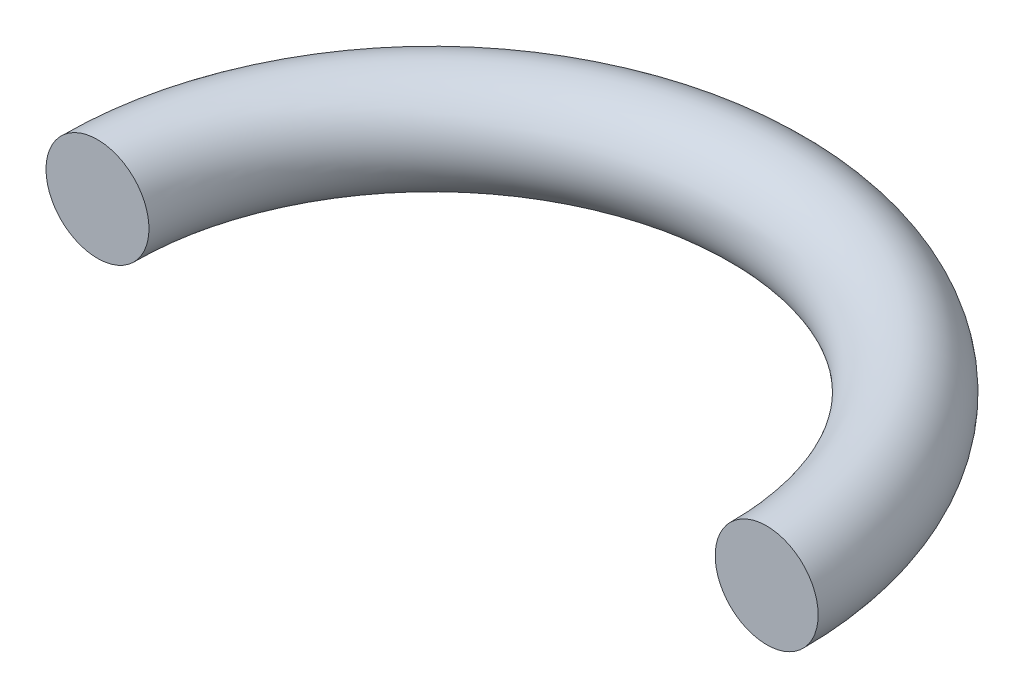
ISO-10303-21;
HEADER;
FILE_DESCRIPTION(('STEP AP214'),'2;1');
FILE_NAME('part.step','',(''),(''),'','','');
FILE_SCHEMA(('AUTOMOTIVE_DESIGN { 1 0 10303 214 1 1 1 1 }'));
ENDSEC;
DATA;
#1=APPLICATION_CONTEXT('core data for automotive mechanical design processes');
#2=APPLICATION_PROTOCOL_DEFINITION('international standard','automotive_design',2000,#1);
#3=PRODUCT_CONTEXT('',#1,'mechanical');
#4=PRODUCT('Part','Part','',(#3));
#5=PRODUCT_RELATED_PRODUCT_CATEGORY('part','',(#4));
#6=PRODUCT_DEFINITION_FORMATION('','',#4);
#7=PRODUCT_DEFINITION_CONTEXT('part definition',#1,'design');
#8=PRODUCT_DEFINITION('design','',#6,#7);
#9=PRODUCT_DEFINITION_SHAPE('','',#8);
#10=(LENGTH_UNIT() NAMED_UNIT(*) SI_UNIT(.MILLI.,.METRE.));
#11=(NAMED_UNIT(*) PLANE_ANGLE_UNIT() SI_UNIT($,.RADIAN.));
#12=(NAMED_UNIT(*) SI_UNIT($,.STERADIAN.) SOLID_ANGLE_UNIT());
#13=UNCERTAINTY_MEASURE_WITH_UNIT(LENGTH_MEASURE(1.E-05),#10,'distance_accuracy_value','');
#14=(GEOMETRIC_REPRESENTATION_CONTEXT(3) GLOBAL_UNCERTAINTY_ASSIGNED_CONTEXT((#13)) GLOBAL_UNIT_ASSIGNED_CONTEXT((#10,
#11,#12)) REPRESENTATION_CONTEXT('',''));
#15=CARTESIAN_POINT('',(0.,0.,0.));
#16=DIRECTION('',(0.,0.,1.));
#17=DIRECTION('',(1.,0.,0.));
#18=AXIS2_PLACEMENT_3D('',#15,#16,#17);
#19=CARTESIAN_POINT('',(0.,0.,0.));
#20=DIRECTION('',(0.,1.,0.));
#21=DIRECTION('',(0.,0.,1.));
#22=AXIS2_PLACEMENT_3D('',#19,#20,#21);
#23=TOROIDAL_SURFACE('',#22,26.,4.);
#24=CARTESIAN_POINT('',(26.,0.,1.81557029619843E-13));
#25=DIRECTION('',(0.,0.,-1.));
#26=DIRECTION('',(-1.,0.,0.));
#27=AXIS2_PLACEMENT_3D('',#24,#25,#26);
#28=CIRCLE('',#27,4.);
#29=CARTESIAN_POINT('',(30.,0.,2.09488880330588E-13));
#30=VERTEX_POINT('',#29);
#31=EDGE_CURVE('E10',#30,#30,#28,.T.);
#32=CARTESIAN_POINT('',(-26.,0.,0.));
#33=DIRECTION('',(0.,0.,1.));
#34=DIRECTION('',(1.,0.,0.));
#35=AXIS2_PLACEMENT_3D('',#32,#33,#34);
#36=CIRCLE('',#35,4.);
#37=CARTESIAN_POINT('',(-30.,0.,0.));
#38=VERTEX_POINT('',#37);
#39=EDGE_CURVE('E36',#38,#38,#36,.T.);
#40=CARTESIAN_POINT('',(0.,0.,0.));
#41=DIRECTION('',(0.,1.,0.));
#42=DIRECTION('',(0.,0.,1.));
#43=AXIS2_PLACEMENT_3D('',#40,#41,#42);
#44=CIRCLE('',#43,30.);
#45=EDGE_CURVE('',#30,#38,#44,.T.);
#46=ORIENTED_EDGE('',*,*,#31,.T.);
#47=ORIENTED_EDGE('',*,*,#39,.F.);
#48=ORIENTED_EDGE('',*,*,#45,.T.);
#49=ORIENTED_EDGE('',*,*,#45,.F.);
#50=EDGE_LOOP('',(#46,#48,#47,#49));
#51=FACE_BOUND('',#50,.T.);
#52=ADVANCED_FACE('F30',(#51),#23,.T.);
#53=CARTESIAN_POINT('',(26.,0.,1.81557029619843E-13));
#54=DIRECTION('',(0.,0.,-1.));
#55=DIRECTION('',(-1.,0.,0.));
#56=AXIS2_PLACEMENT_3D('',#53,#54,#55);
#57=PLANE('',#56);
#58=ORIENTED_EDGE('',*,*,#31,.F.);
#59=EDGE_LOOP('',(#58));
#60=FACE_BOUND('',#59,.T.);
#61=ADVANCED_FACE('F45',(#60),#57,.F.);
#62=CARTESIAN_POINT('',(-26.,0.,0.));
#63=DIRECTION('',(0.,0.,1.));
#64=DIRECTION('',(1.,0.,0.));
#65=AXIS2_PLACEMENT_3D('',#62,#63,#64);
#66=PLANE('',#65);
#67=ORIENTED_EDGE('',*,*,#39,.T.);
#68=EDGE_LOOP('',(#67));
#69=FACE_BOUND('',#68,.T.);
#70=ADVANCED_FACE('F42',(#69),#66,.T.);
#71=CLOSED_SHELL('',(#52,#61,#70));
#72=MANIFOLD_SOLID_BREP('B2',#71);
#73=ADVANCED_BREP_SHAPE_REPRESENTATION('',(#18,#72),#14);
#74=SHAPE_DEFINITION_REPRESENTATION(#9,#73);
ENDSEC;
END-ISO-10303-21;
